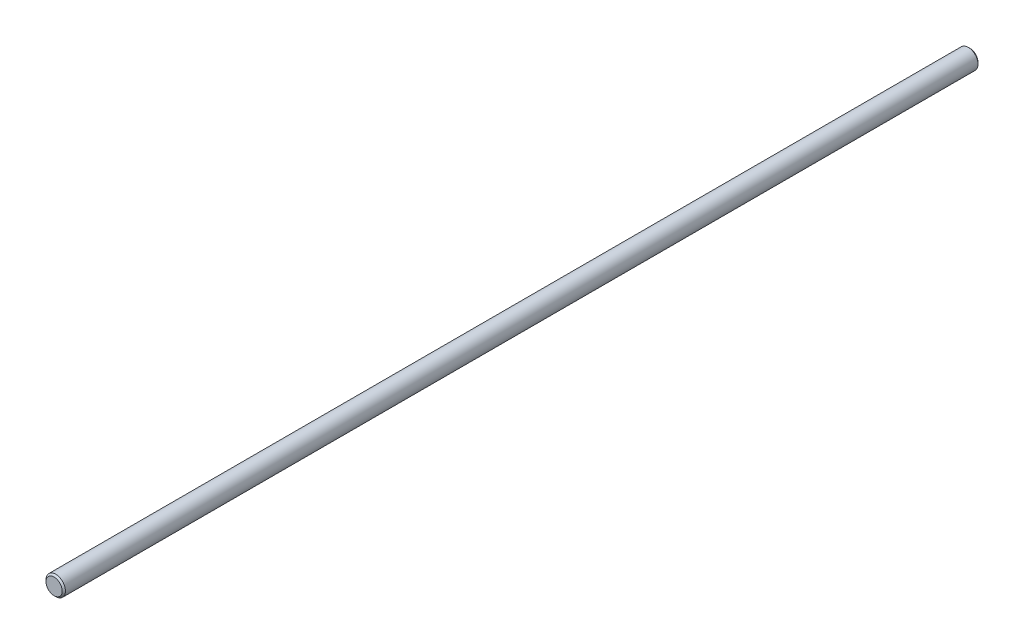
ISO-10303-21;
HEADER;
FILE_DESCRIPTION(('STEP AP214'),'2;1');
FILE_NAME('part.step','',(''),(''),'','','');
FILE_SCHEMA(('AUTOMOTIVE_DESIGN { 1 0 10303 214 1 1 1 1 }'));
ENDSEC;
DATA;
#1=APPLICATION_CONTEXT('core data for automotive mechanical design processes');
#2=APPLICATION_PROTOCOL_DEFINITION('international standard','automotive_design',2000,#1);
#3=PRODUCT_CONTEXT('',#1,'mechanical');
#4=PRODUCT('Part','Part','',(#3));
#5=PRODUCT_RELATED_PRODUCT_CATEGORY('part','',(#4));
#6=PRODUCT_DEFINITION_FORMATION('','',#4);
#7=PRODUCT_DEFINITION_CONTEXT('part definition',#1,'design');
#8=PRODUCT_DEFINITION('design','',#6,#7);
#9=PRODUCT_DEFINITION_SHAPE('','',#8);
#10=(LENGTH_UNIT() NAMED_UNIT(*) SI_UNIT(.MILLI.,.METRE.));
#11=(NAMED_UNIT(*) PLANE_ANGLE_UNIT() SI_UNIT($,.RADIAN.));
#12=(NAMED_UNIT(*) SI_UNIT($,.STERADIAN.) SOLID_ANGLE_UNIT());
#13=UNCERTAINTY_MEASURE_WITH_UNIT(LENGTH_MEASURE(1.E-05),#10,'distance_accuracy_value','');
#14=(GEOMETRIC_REPRESENTATION_CONTEXT(3) GLOBAL_UNCERTAINTY_ASSIGNED_CONTEXT((#13)) GLOBAL_UNIT_ASSIGNED_CONTEXT((#10,
#11,#12)) REPRESENTATION_CONTEXT('',''));
#15=CARTESIAN_POINT('',(0.,0.,0.));
#16=DIRECTION('',(0.,0.,1.));
#17=DIRECTION('',(1.,0.,0.));
#18=AXIS2_PLACEMENT_3D('',#15,#16,#17);
#19=CARTESIAN_POINT('',(0.,0.,141.25));
#20=DIRECTION('',(0.,0.,-1.));
#21=DIRECTION('',(-1.,0.,0.));
#22=AXIS2_PLACEMENT_3D('',#19,#20,#21);
#23=CYLINDRICAL_SURFACE('',#22,3.);
#24=CARTESIAN_POINT('',(0.,0.,140.75));
#25=DIRECTION('',(0.,0.,1.));
#26=DIRECTION('',(1.,0.,0.));
#27=AXIS2_PLACEMENT_3D('',#24,#25,#26);
#28=CIRCLE('',#27,3.);
#29=CARTESIAN_POINT('',(3.,0.,140.75));
#30=VERTEX_POINT('',#29);
#31=EDGE_CURVE('E47',#30,#30,#28,.F.);
#32=ORIENTED_EDGE('',*,*,#31,.T.);
#33=EDGE_LOOP('',(#32));
#34=FACE_BOUND('',#33,.T.);
#35=CARTESIAN_POINT('',(0.,0.,-140.75));
#36=DIRECTION('',(0.,0.,1.));
#37=DIRECTION('',(1.,0.,0.));
#38=AXIS2_PLACEMENT_3D('',#35,#36,#37);
#39=CIRCLE('',#38,3.);
#40=CARTESIAN_POINT('',(3.,0.,-140.75));
#41=VERTEX_POINT('',#40);
#42=EDGE_CURVE('E51',#41,#41,#39,.T.);
#43=ORIENTED_EDGE('',*,*,#42,.T.);
#44=EDGE_LOOP('',(#43));
#45=FACE_BOUND('',#44,.T.);
#46=ADVANCED_FACE('F39',(#34,#45),#23,.T.);
#47=CARTESIAN_POINT('',(0.,0.,141.25));
#48=DIRECTION('',(0.,0.,1.));
#49=DIRECTION('',(1.,0.,0.));
#50=AXIS2_PLACEMENT_3D('',#47,#48,#49);
#51=PLANE('',#50);
#52=CARTESIAN_POINT('',(0.,0.,141.25));
#53=DIRECTION('',(0.,0.,1.));
#54=DIRECTION('',(1.,0.,0.));
#55=AXIS2_PLACEMENT_3D('',#52,#53,#54);
#56=CIRCLE('',#55,2.5);
#57=CARTESIAN_POINT('',(2.5,0.,141.25));
#58=VERTEX_POINT('',#57);
#59=EDGE_CURVE('E55',#58,#58,#56,.T.);
#60=ORIENTED_EDGE('',*,*,#59,.T.);
#61=EDGE_LOOP('',(#60));
#62=FACE_BOUND('',#61,.T.);
#63=ADVANCED_FACE('F61',(#62),#51,.T.);
#64=CARTESIAN_POINT('',(0.,0.,-141.25));
#65=DIRECTION('',(0.,0.,1.));
#66=DIRECTION('',(1.,0.,0.));
#67=AXIS2_PLACEMENT_3D('',#64,#65,#66);
#68=PLANE('',#67);
#69=CARTESIAN_POINT('',(0.,0.,-141.25));
#70=DIRECTION('',(0.,0.,1.));
#71=DIRECTION('',(1.,0.,0.));
#72=AXIS2_PLACEMENT_3D('',#69,#70,#71);
#73=CIRCLE('',#72,2.49999999999997);
#74=CARTESIAN_POINT('',(2.49999999999997,0.,-141.25));
#75=VERTEX_POINT('',#74);
#76=EDGE_CURVE('E10',#75,#75,#73,.F.);
#77=ORIENTED_EDGE('',*,*,#76,.T.);
#78=EDGE_LOOP('',(#77));
#79=FACE_BOUND('',#78,.T.);
#80=ADVANCED_FACE('F65',(#79),#68,.F.);
#81=CARTESIAN_POINT('',(0.,0.,141.25));
#82=DIRECTION('',(0.,0.,-1.));
#83=DIRECTION('',(-1.,0.,0.));
#84=AXIS2_PLACEMENT_3D('',#81,#82,#83);
#85=CONICAL_SURFACE('',#84,2.5,0.785398163397446);
#86=ORIENTED_EDGE('',*,*,#31,.F.);
#87=EDGE_LOOP('',(#86));
#88=FACE_BOUND('',#87,.T.);
#89=ORIENTED_EDGE('',*,*,#59,.F.);
#90=EDGE_LOOP('',(#89));
#91=FACE_BOUND('',#90,.T.);
#92=ADVANCED_FACE('F63',(#88,#91),#85,.T.);
#93=CARTESIAN_POINT('',(0.,0.,-140.75));
#94=DIRECTION('',(0.,0.,1.));
#95=DIRECTION('',(1.,0.,0.));
#96=AXIS2_PLACEMENT_3D('',#93,#94,#95);
#97=CONICAL_SURFACE('',#96,3.,0.785398163397418);
#98=ORIENTED_EDGE('',*,*,#76,.F.);
#99=EDGE_LOOP('',(#98));
#100=FACE_BOUND('',#99,.T.);
#101=ORIENTED_EDGE('',*,*,#42,.F.);
#102=EDGE_LOOP('',(#101));
#103=FACE_BOUND('',#102,.T.);
#104=ADVANCED_FACE('F42',(#100,#103),#97,.T.);
#105=CLOSED_SHELL('',(#46,#63,#80,#92,#104));
#106=MANIFOLD_SOLID_BREP('B2',#105);
#107=ADVANCED_BREP_SHAPE_REPRESENTATION('',(#18,#106),#14);
#108=SHAPE_DEFINITION_REPRESENTATION(#9,#107);
ENDSEC;
END-ISO-10303-21;
